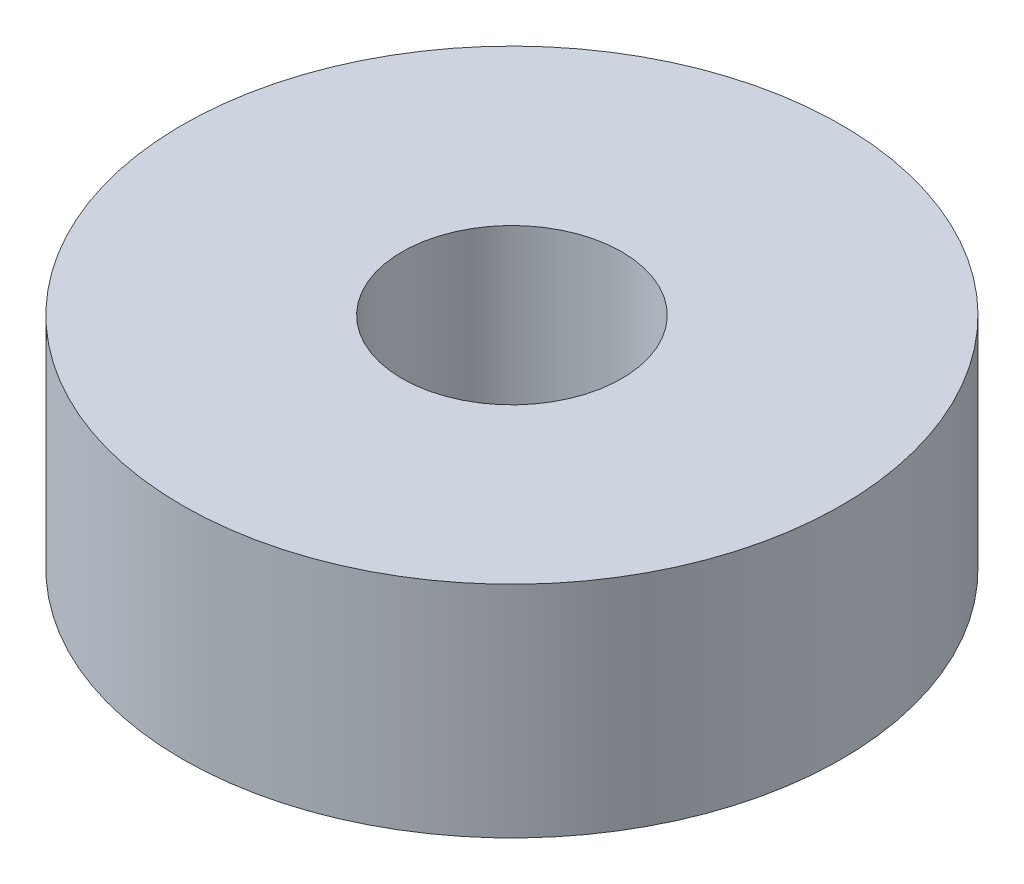
ISO-10303-21;
HEADER;
FILE_DESCRIPTION(('STEP AP214'),'2;1');
FILE_NAME('part.step','',(''),(''),'','','');
FILE_SCHEMA(('AUTOMOTIVE_DESIGN { 1 0 10303 214 1 1 1 1 }'));
ENDSEC;
DATA;
#1=APPLICATION_CONTEXT('core data for automotive mechanical design processes');
#2=APPLICATION_PROTOCOL_DEFINITION('international standard','automotive_design',2000,#1);
#3=PRODUCT_CONTEXT('',#1,'mechanical');
#4=PRODUCT('Part','Part','',(#3));
#5=PRODUCT_RELATED_PRODUCT_CATEGORY('part','',(#4));
#6=PRODUCT_DEFINITION_FORMATION('','',#4);
#7=PRODUCT_DEFINITION_CONTEXT('part definition',#1,'design');
#8=PRODUCT_DEFINITION('design','',#6,#7);
#9=PRODUCT_DEFINITION_SHAPE('','',#8);
#10=(LENGTH_UNIT() NAMED_UNIT(*) SI_UNIT(.MILLI.,.METRE.));
#11=(NAMED_UNIT(*) PLANE_ANGLE_UNIT() SI_UNIT($,.RADIAN.));
#12=(NAMED_UNIT(*) SI_UNIT($,.STERADIAN.) SOLID_ANGLE_UNIT());
#13=UNCERTAINTY_MEASURE_WITH_UNIT(LENGTH_MEASURE(1.E-05),#10,'distance_accuracy_value','');
#14=(GEOMETRIC_REPRESENTATION_CONTEXT(3) GLOBAL_UNCERTAINTY_ASSIGNED_CONTEXT((#13)) GLOBAL_UNIT_ASSIGNED_CONTEXT((#10,
#11,#12)) REPRESENTATION_CONTEXT('',''));
#15=CARTESIAN_POINT('',(0.,0.,0.));
#16=DIRECTION('',(0.,0.,1.));
#17=DIRECTION('',(1.,0.,0.));
#18=AXIS2_PLACEMENT_3D('',#15,#16,#17);
#19=CARTESIAN_POINT('',(0.,3.175,0.));
#20=DIRECTION('',(0.,1.,0.));
#21=DIRECTION('',(0.,0.,1.));
#22=AXIS2_PLACEMENT_3D('',#19,#20,#21);
#23=PLANE('',#22);
#24=CARTESIAN_POINT('',(0.,3.175,0.));
#25=DIRECTION('',(0.,1.,0.));
#26=DIRECTION('',(0.,0.,1.));
#27=AXIS2_PLACEMENT_3D('',#24,#25,#26);
#28=CIRCLE('',#27,9.525);
#29=CARTESIAN_POINT('',(0.,3.175,9.525));
#30=VERTEX_POINT('',#29);
#31=EDGE_CURVE('E10',#30,#30,#28,.T.);
#32=ORIENTED_EDGE('',*,*,#31,.T.);
#33=EDGE_LOOP('',(#32));
#34=FACE_BOUND('',#33,.T.);
#35=CARTESIAN_POINT('',(0.,3.175,0.));
#36=DIRECTION('',(0.,1.,0.));
#37=DIRECTION('',(0.,0.,1.));
#38=AXIS2_PLACEMENT_3D('',#35,#36,#37);
#39=CIRCLE('',#38,3.175);
#40=CARTESIAN_POINT('',(0.,3.175,3.175));
#41=VERTEX_POINT('',#40);
#42=EDGE_CURVE('E42',#41,#41,#39,.T.);
#43=ORIENTED_EDGE('',*,*,#42,.F.);
#44=EDGE_LOOP('',(#43));
#45=FACE_BOUND('',#44,.T.);
#46=ADVANCED_FACE('F31',(#34,#45),#23,.T.);
#47=CARTESIAN_POINT('',(0.,-3.175,0.));
#48=DIRECTION('',(0.,1.,0.));
#49=DIRECTION('',(0.,0.,1.));
#50=AXIS2_PLACEMENT_3D('',#47,#48,#49);
#51=PLANE('',#50);
#52=CARTESIAN_POINT('',(0.,-3.175,0.));
#53=DIRECTION('',(0.,1.,0.));
#54=DIRECTION('',(0.,0.,1.));
#55=AXIS2_PLACEMENT_3D('',#52,#53,#54);
#56=CIRCLE('',#55,9.525);
#57=CARTESIAN_POINT('',(0.,-3.175,9.525));
#58=VERTEX_POINT('',#57);
#59=EDGE_CURVE('E35',#58,#58,#56,.T.);
#60=ORIENTED_EDGE('',*,*,#59,.F.);
#61=EDGE_LOOP('',(#60));
#62=FACE_BOUND('',#61,.T.);
#63=CARTESIAN_POINT('',(0.,-3.175,0.));
#64=DIRECTION('',(0.,1.,0.));
#65=DIRECTION('',(0.,0.,1.));
#66=AXIS2_PLACEMENT_3D('',#63,#64,#65);
#67=CIRCLE('',#66,3.175);
#68=CARTESIAN_POINT('',(0.,-3.175,3.175));
#69=VERTEX_POINT('',#68);
#70=EDGE_CURVE('E44',#69,#69,#67,.T.);
#71=ORIENTED_EDGE('',*,*,#70,.T.);
#72=EDGE_LOOP('',(#71));
#73=FACE_BOUND('',#72,.T.);
#74=ADVANCED_FACE('F54',(#62,#73),#51,.F.);
#75=CARTESIAN_POINT('',(0.,3.175,0.));
#76=DIRECTION('',(0.,-1.,0.));
#77=DIRECTION('',(0.,0.,-1.));
#78=AXIS2_PLACEMENT_3D('',#75,#76,#77);
#79=CYLINDRICAL_SURFACE('',#78,9.525);
#80=ORIENTED_EDGE('',*,*,#31,.F.);
#81=EDGE_LOOP('',(#80));
#82=FACE_BOUND('',#81,.T.);
#83=ORIENTED_EDGE('',*,*,#59,.T.);
#84=EDGE_LOOP('',(#83));
#85=FACE_BOUND('',#84,.T.);
#86=ADVANCED_FACE('F33',(#82,#85),#79,.T.);
#87=CARTESIAN_POINT('',(0.,3.175,0.));
#88=DIRECTION('',(0.,-1.,0.));
#89=DIRECTION('',(0.,0.,-1.));
#90=AXIS2_PLACEMENT_3D('',#87,#88,#89);
#91=CYLINDRICAL_SURFACE('',#90,3.175);
#92=ORIENTED_EDGE('',*,*,#42,.T.);
#93=EDGE_LOOP('',(#92));
#94=FACE_BOUND('',#93,.T.);
#95=ORIENTED_EDGE('',*,*,#70,.F.);
#96=EDGE_LOOP('',(#95));
#97=FACE_BOUND('',#96,.T.);
#98=ADVANCED_FACE('F50',(#94,#97),#91,.F.);
#99=CLOSED_SHELL('',(#46,#74,#86,#98));
#100=MANIFOLD_SOLID_BREP('B2',#99);
#101=ADVANCED_BREP_SHAPE_REPRESENTATION('',(#18,#100),#14);
#102=SHAPE_DEFINITION_REPRESENTATION(#9,#101);
ENDSEC;
END-ISO-10303-21;
